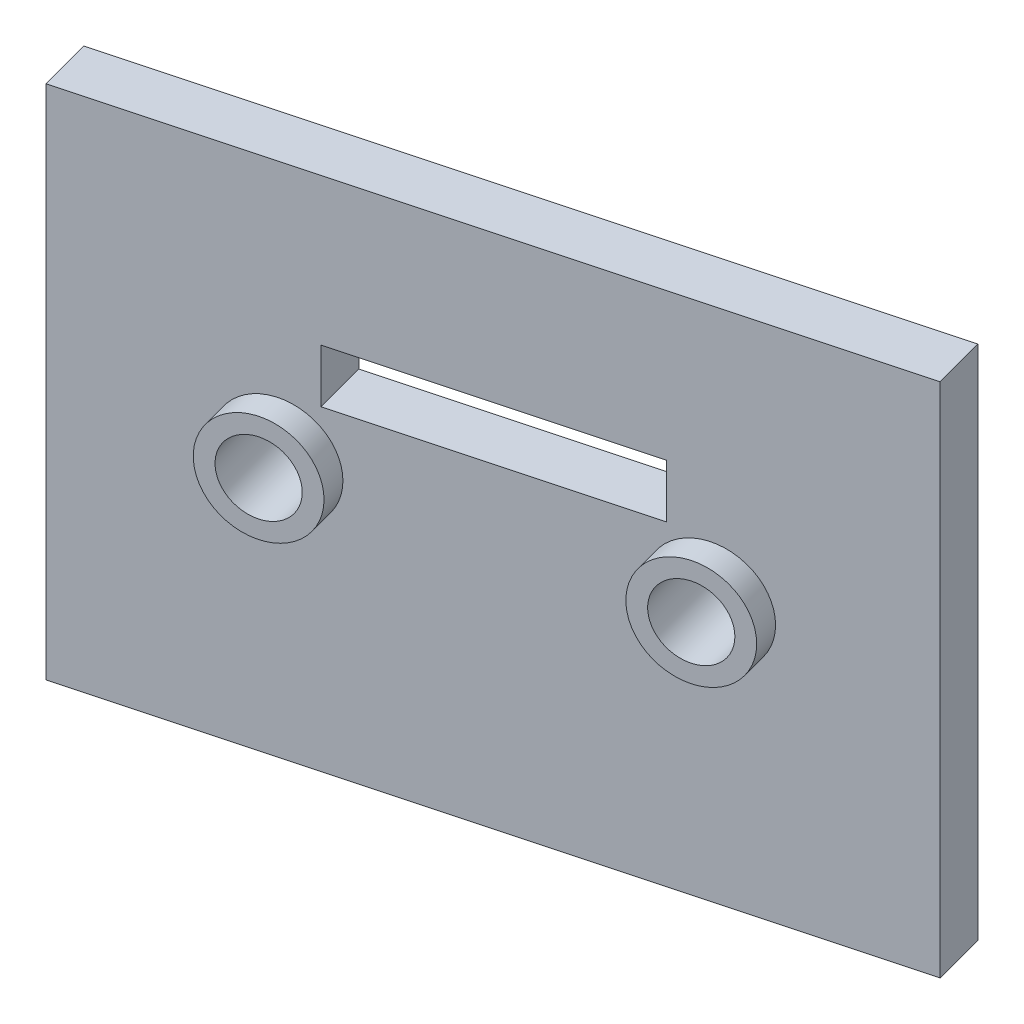
ISO-10303-21;
HEADER;
FILE_DESCRIPTION(('STEP AP214'),'2;1');
FILE_NAME('part.step','',(''),(''),'','','');
FILE_SCHEMA(('AUTOMOTIVE_DESIGN { 1 0 10303 214 1 1 1 1 }'));
ENDSEC;
DATA;
#1=APPLICATION_CONTEXT('core data for automotive mechanical design processes');
#2=APPLICATION_PROTOCOL_DEFINITION('international standard','automotive_design',2000,#1);
#3=PRODUCT_CONTEXT('',#1,'mechanical');
#4=PRODUCT('Part','Part','',(#3));
#5=PRODUCT_RELATED_PRODUCT_CATEGORY('part','',(#4));
#6=PRODUCT_DEFINITION_FORMATION('','',#4);
#7=PRODUCT_DEFINITION_CONTEXT('part definition',#1,'design');
#8=PRODUCT_DEFINITION('design','',#6,#7);
#9=PRODUCT_DEFINITION_SHAPE('','',#8);
#10=(LENGTH_UNIT() NAMED_UNIT(*) SI_UNIT(.MILLI.,.METRE.));
#11=(NAMED_UNIT(*) PLANE_ANGLE_UNIT() SI_UNIT($,.RADIAN.));
#12=(NAMED_UNIT(*) SI_UNIT($,.STERADIAN.) SOLID_ANGLE_UNIT());
#13=UNCERTAINTY_MEASURE_WITH_UNIT(LENGTH_MEASURE(1.E-05),#10,'distance_accuracy_value','');
#14=(GEOMETRIC_REPRESENTATION_CONTEXT(3) GLOBAL_UNCERTAINTY_ASSIGNED_CONTEXT((#13)) GLOBAL_UNIT_ASSIGNED_CONTEXT((#10,
#11,#12)) REPRESENTATION_CONTEXT('',''));
#15=CARTESIAN_POINT('',(0.,0.,0.));
#16=DIRECTION('',(0.,0.,1.));
#17=DIRECTION('',(1.,0.,0.));
#18=AXIS2_PLACEMENT_3D('',#15,#16,#17);
#19=CARTESIAN_POINT('',(28.4898075653215,0.5,2.9744443697168));
#20=DIRECTION('',(0.258819045102521,0.,0.965925826289069));
#21=DIRECTION('',(0.965925826289069,0.,-0.258819045102521));
#22=AXIS2_PLACEMENT_3D('',#19,#20,#21);
#23=PLANE('',#22);
#24=CARTESIAN_POINT('',(38.1036080524068,0.500000000000006,0.398434293008355));
#25=DIRECTION('',(0.258819045102521,0.,0.965925826289069));
#26=DIRECTION('',(0.965925826289069,0.,-0.258819045102521));
#27=AXIS2_PLACEMENT_3D('',#24,#25,#26);
#28=CIRCLE('',#27,3.);
#29=CARTESIAN_POINT('',(41.001385531274,0.500000000000006,-0.378022842299207));
#30=VERTEX_POINT('',#29);
#31=EDGE_CURVE('E146',#30,#30,#28,.T.);
#32=ORIENTED_EDGE('',*,*,#31,.F.);
#33=EDGE_LOOP('',(#32));
#34=FACE_BOUND('',#33,.T.);
#35=CARTESIAN_POINT('',(18.9394628566391,0.500000000000006,5.5334515218471));
#36=DIRECTION('',(0.258819045102521,0.,0.965925826289069));
#37=DIRECTION('',(0.965925826289069,0.,-0.258819045102521));
#38=AXIS2_PLACEMENT_3D('',#35,#36,#37);
#39=CIRCLE('',#38,3.);
#40=CARTESIAN_POINT('',(21.8372403355063,0.500000000000006,4.75699438653954));
#41=VERTEX_POINT('',#40);
#42=EDGE_CURVE('E150',#41,#41,#39,.T.);
#43=ORIENTED_EDGE('',*,*,#42,.F.);
#44=EDGE_LOOP('',(#43));
#45=FACE_BOUND('',#44,.T.);
#46=DIRECTION('',(0.,1.,0.));
#47=VECTOR('',#46,1.);
#48=CARTESIAN_POINT('',(48.2912870042474,15.,-2.33134605488487));
#49=LINE('',#48,#47);
#50=CARTESIAN_POINT('',(48.2912870042474,-14.,-2.33134605488487));
#51=VERTEX_POINT('',#50);
#52=CARTESIAN_POINT('',(48.2912870042474,15.,-2.33134605488487));
#53=VERTEX_POINT('',#52);
#54=EDGE_CURVE('E159',#51,#53,#49,.T.);
#55=ORIENTED_EDGE('',*,*,#54,.T.);
#56=DIRECTION('',(-0.965925826289069,0.,0.258819045102521));
#57=VECTOR('',#56,1.);
#58=CARTESIAN_POINT('',(8.68832812639561,15.,8.28023479431848));
#59=LINE('',#58,#57);
#60=CARTESIAN_POINT('',(8.68832812639561,15.,8.28023479431848));
#61=VERTEX_POINT('',#60);
#62=EDGE_CURVE('E162',#53,#61,#59,.T.);
#63=ORIENTED_EDGE('',*,*,#62,.T.);
#64=DIRECTION('',(0.,-1.,0.));
#65=VECTOR('',#64,1.);
#66=CARTESIAN_POINT('',(8.68832812639561,15.,8.28023479431848));
#67=LINE('',#66,#65);
#68=CARTESIAN_POINT('',(8.68832812639561,-14.,8.28023479431847));
#69=VERTEX_POINT('',#68);
#70=EDGE_CURVE('E165',#61,#69,#67,.T.);
#71=ORIENTED_EDGE('',*,*,#70,.T.);
#72=DIRECTION('',(0.965925826289069,0.,-0.258819045102521));
#73=VECTOR('',#72,1.);
#74=CARTESIAN_POINT('',(8.68832812639561,-14.,8.28023479431847));
#75=LINE('',#74,#73);
#76=EDGE_CURVE('E167',#69,#51,#75,.T.);
#77=ORIENTED_EDGE('',*,*,#76,.T.);
#78=EDGE_LOOP('',(#55,#63,#71,#77));
#79=FACE_BOUND('',#78,.T.);
#80=DIRECTION('',(0.,1.,0.));
#81=VECTOR('',#80,1.);
#82=CARTESIAN_POINT('',(20.8713145092172,0.5,5.01581343164206));
#83=LINE('',#82,#81);
#84=CARTESIAN_POINT('',(20.8713145092172,3.75000000000001,5.01581343164206));
#85=VERTEX_POINT('',#84);
#86=CARTESIAN_POINT('',(20.8713145092172,6.75000000000001,5.01581343164206));
#87=VERTEX_POINT('',#86);
#88=EDGE_CURVE('E106',#85,#87,#83,.T.);
#89=ORIENTED_EDGE('',*,*,#88,.T.);
#90=DIRECTION('',(0.965925826289068,0.,-0.258819045102521));
#91=VECTOR('',#90,1.);
#92=CARTESIAN_POINT('',(28.4898075653215,6.75000000000001,2.9744443697168));
#93=LINE('',#92,#91);
#94=CARTESIAN_POINT('',(36.1717563998287,6.75000000000001,0.916072383213399));
#95=VERTEX_POINT('',#94);
#96=EDGE_CURVE('E131',#87,#95,#93,.T.);
#97=ORIENTED_EDGE('',*,*,#96,.T.);
#98=DIRECTION('',(0.,-1.,0.));
#99=VECTOR('',#98,1.);
#100=CARTESIAN_POINT('',(36.1717563998287,0.5,0.916072383213399));
#101=LINE('',#100,#99);
#102=CARTESIAN_POINT('',(36.1717563998287,3.75000000000001,0.916072383213403));
#103=VERTEX_POINT('',#102);
#104=EDGE_CURVE('E126',#95,#103,#101,.T.);
#105=ORIENTED_EDGE('',*,*,#104,.T.);
#106=DIRECTION('',(0.965925826289068,0.,-0.258819045102521));
#107=VECTOR('',#106,1.);
#108=CARTESIAN_POINT('',(28.4898075653215,3.75000000000001,2.9744443697168));
#109=LINE('',#108,#107);
#110=EDGE_CURVE('E129',#85,#103,#109,.T.);
#111=ORIENTED_EDGE('',*,*,#110,.F.);
#112=EDGE_LOOP('',(#89,#97,#105,#111));
#113=FACE_BOUND('',#112,.T.);
#114=ADVANCED_FACE('F39',(#34,#45,#79,#113),#23,.T.);
#115=CARTESIAN_POINT('',(27.713350430014,0.5,0.076666890849595));
#116=DIRECTION('',(0.258819045102521,0.,0.965925826289069));
#117=DIRECTION('',(0.965925826289069,0.,-0.258819045102521));
#118=AXIS2_PLACEMENT_3D('',#115,#116,#117);
#119=PLANE('',#118);
#120=CARTESIAN_POINT('',(37.3271509170993,0.500000000000006,-2.49934318585885));
#121=DIRECTION('',(0.258819045102521,0.,0.965925826289069));
#122=DIRECTION('',(0.965925826289069,0.,-0.258819045102521));
#123=AXIS2_PLACEMENT_3D('',#120,#121,#122);
#124=CIRCLE('',#123,2.);
#125=CARTESIAN_POINT('',(39.2590025696774,0.500000000000006,-3.01698127606389));
#126=VERTEX_POINT('',#125);
#127=EDGE_CURVE('E143',#126,#126,#124,.T.);
#128=ORIENTED_EDGE('',*,*,#127,.T.);
#129=EDGE_LOOP('',(#128));
#130=FACE_BOUND('',#129,.T.);
#131=CARTESIAN_POINT('',(18.1630057213315,0.500000000000006,2.6356740429799));
#132=DIRECTION('',(0.258819045102521,0.,0.965925826289069));
#133=DIRECTION('',(0.965925826289069,0.,-0.258819045102521));
#134=AXIS2_PLACEMENT_3D('',#131,#132,#133);
#135=CIRCLE('',#134,2.);
#136=CARTESIAN_POINT('',(20.0948573739097,0.500000000000006,2.11803595277486));
#137=VERTEX_POINT('',#136);
#138=EDGE_CURVE('E137',#137,#137,#135,.T.);
#139=ORIENTED_EDGE('',*,*,#138,.T.);
#140=EDGE_LOOP('',(#139));
#141=FACE_BOUND('',#140,.T.);
#142=DIRECTION('',(0.965925826289068,0.,-0.258819045102521));
#143=VECTOR('',#142,1.);
#144=CARTESIAN_POINT('',(1.87560918953314,3.75,6.99986879048075));
#145=LINE('',#144,#143);
#146=CARTESIAN_POINT('',(20.0948573739097,3.75,2.11803595277486));
#147=VERTEX_POINT('',#146);
#148=CARTESIAN_POINT('',(35.3952992645211,3.75000000000001,-1.9817050956538));
#149=VERTEX_POINT('',#148);
#150=EDGE_CURVE('E111',#147,#149,#145,.T.);
#151=ORIENTED_EDGE('',*,*,#150,.T.);
#152=DIRECTION('',(0.,-1.,0.));
#153=VECTOR('',#152,1.);
#154=CARTESIAN_POINT('',(35.3952992645211,0.5,-1.98170509565381));
#155=LINE('',#154,#153);
#156=CARTESIAN_POINT('',(35.3952992645211,6.75000000000001,-1.98170509565381));
#157=VERTEX_POINT('',#156);
#158=EDGE_CURVE('E121',#157,#149,#155,.T.);
#159=ORIENTED_EDGE('',*,*,#158,.F.);
#160=DIRECTION('',(0.965925826289068,0.,-0.258819045102521));
#161=VECTOR('',#160,1.);
#162=CARTESIAN_POINT('',(27.713350430014,6.75000000000001,0.076666890849595));
#163=LINE('',#162,#161);
#164=CARTESIAN_POINT('',(20.0948573739097,6.75000000000001,2.11803595277486));
#165=VERTEX_POINT('',#164);
#166=EDGE_CURVE('E11',#165,#157,#163,.T.);
#167=ORIENTED_EDGE('',*,*,#166,.F.);
#168=DIRECTION('',(0.,1.,0.));
#169=VECTOR('',#168,1.);
#170=CARTESIAN_POINT('',(20.0948573739097,0.5,2.11803595277486));
#171=LINE('',#170,#169);
#172=EDGE_CURVE('E103',#147,#165,#171,.T.);
#173=ORIENTED_EDGE('',*,*,#172,.F.);
#174=EDGE_LOOP('',(#151,#159,#167,#173));
#175=FACE_BOUND('',#174,.T.);
#176=DIRECTION('',(0.,1.,0.));
#177=VECTOR('',#176,1.);
#178=CARTESIAN_POINT('',(47.5148298689398,15.,-5.22912353375208));
#179=LINE('',#178,#177);
#180=CARTESIAN_POINT('',(47.5148298689398,-14.,-5.22912353375208));
#181=VERTEX_POINT('',#180);
#182=CARTESIAN_POINT('',(47.5148298689398,15.,-5.22912353375208));
#183=VERTEX_POINT('',#182);
#184=EDGE_CURVE('E156',#181,#183,#179,.T.);
#185=ORIENTED_EDGE('',*,*,#184,.F.);
#186=DIRECTION('',(0.965925826289069,0.,-0.258819045102521));
#187=VECTOR('',#186,1.);
#188=CARTESIAN_POINT('',(7.91187099108805,-14.,5.38245731545127));
#189=LINE('',#188,#187);
#190=CARTESIAN_POINT('',(7.91187099108805,-14.,5.38245731545127));
#191=VERTEX_POINT('',#190);
#192=EDGE_CURVE('E163',#191,#181,#189,.T.);
#193=ORIENTED_EDGE('',*,*,#192,.F.);
#194=DIRECTION('',(0.,-1.,0.));
#195=VECTOR('',#194,1.);
#196=CARTESIAN_POINT('',(7.91187099108804,15.,5.38245731545127));
#197=LINE('',#196,#195);
#198=CARTESIAN_POINT('',(7.91187099108804,15.,5.38245731545127));
#199=VERTEX_POINT('',#198);
#200=EDGE_CURVE('E174',#199,#191,#197,.T.);
#201=ORIENTED_EDGE('',*,*,#200,.F.);
#202=DIRECTION('',(-0.965925826289069,0.,0.258819045102521));
#203=VECTOR('',#202,1.);
#204=CARTESIAN_POINT('',(7.91187099108804,15.,5.38245731545127));
#205=LINE('',#204,#203);
#206=EDGE_CURVE('E172',#183,#199,#205,.T.);
#207=ORIENTED_EDGE('',*,*,#206,.F.);
#208=EDGE_LOOP('',(#185,#193,#201,#207));
#209=FACE_BOUND('',#208,.T.);
#210=ADVANCED_FACE('F118',(#130,#141,#175,#209),#119,.F.);
#211=CARTESIAN_POINT('',(48.2912870042474,15.,-2.33134605488487));
#212=DIRECTION('',(-0.965925826289069,0.,0.258819045102521));
#213=DIRECTION('',(0.258819045102521,0.,0.965925826289069));
#214=AXIS2_PLACEMENT_3D('',#211,#212,#213);
#215=PLANE('',#214);
#216=ORIENTED_EDGE('',*,*,#184,.T.);
#217=DIRECTION('',(-0.258819045102521,0.,-0.965925826289069));
#218=VECTOR('',#217,1.);
#219=CARTESIAN_POINT('',(48.2912870042474,15.,-2.33134605488487));
#220=LINE('',#219,#218);
#221=EDGE_CURVE('E47',#53,#183,#220,.T.);
#222=ORIENTED_EDGE('',*,*,#221,.F.);
#223=ORIENTED_EDGE('',*,*,#54,.F.);
#224=DIRECTION('',(-0.258819045102521,0.,-0.965925826289069));
#225=VECTOR('',#224,1.);
#226=CARTESIAN_POINT('',(48.2912870042474,-14.,-2.33134605488487));
#227=LINE('',#226,#225);
#228=EDGE_CURVE('E169',#51,#181,#227,.T.);
#229=ORIENTED_EDGE('',*,*,#228,.T.);
#230=EDGE_LOOP('',(#216,#222,#223,#229));
#231=FACE_BOUND('',#230,.T.);
#232=ADVANCED_FACE('F41',(#231),#215,.F.);
#233=CARTESIAN_POINT('',(8.68832812639561,15.,8.28023479431848));
#234=DIRECTION('',(0.,-1.,0.));
#235=DIRECTION('',(-0.258819045102521,0.,-0.965925826289069));
#236=AXIS2_PLACEMENT_3D('',#233,#234,#235);
#237=PLANE('',#236);
#238=ORIENTED_EDGE('',*,*,#206,.T.);
#239=DIRECTION('',(-0.258819045102521,0.,-0.965925826289069));
#240=VECTOR('',#239,1.);
#241=CARTESIAN_POINT('',(8.68832812639561,15.,8.28023479431848));
#242=LINE('',#241,#240);
#243=EDGE_CURVE('E182',#61,#199,#242,.T.);
#244=ORIENTED_EDGE('',*,*,#243,.F.);
#245=ORIENTED_EDGE('',*,*,#62,.F.);
#246=ORIENTED_EDGE('',*,*,#221,.T.);
#247=EDGE_LOOP('',(#238,#244,#245,#246));
#248=FACE_BOUND('',#247,.T.);
#249=ADVANCED_FACE('F187',(#248),#237,.F.);
#250=CARTESIAN_POINT('',(8.68832812639561,15.,8.28023479431848));
#251=DIRECTION('',(0.965925826289069,0.,-0.258819045102521));
#252=DIRECTION('',(0.,1.,0.));
#253=AXIS2_PLACEMENT_3D('',#250,#251,#252);
#254=PLANE('',#253);
#255=ORIENTED_EDGE('',*,*,#200,.T.);
#256=DIRECTION('',(-0.258819045102521,0.,-0.965925826289069));
#257=VECTOR('',#256,1.);
#258=CARTESIAN_POINT('',(8.68832812639561,-14.,8.28023479431847));
#259=LINE('',#258,#257);
#260=EDGE_CURVE('E179',#69,#191,#259,.T.);
#261=ORIENTED_EDGE('',*,*,#260,.F.);
#262=ORIENTED_EDGE('',*,*,#70,.F.);
#263=ORIENTED_EDGE('',*,*,#243,.T.);
#264=EDGE_LOOP('',(#255,#261,#262,#263));
#265=FACE_BOUND('',#264,.T.);
#266=ADVANCED_FACE('F197',(#265),#254,.F.);
#267=CARTESIAN_POINT('',(8.68832812639561,-14.,8.28023479431847));
#268=DIRECTION('',(0.,1.,0.));
#269=DIRECTION('',(0.258819045102521,0.,0.965925826289069));
#270=AXIS2_PLACEMENT_3D('',#267,#268,#269);
#271=PLANE('',#270);
#272=ORIENTED_EDGE('',*,*,#192,.T.);
#273=ORIENTED_EDGE('',*,*,#228,.F.);
#274=ORIENTED_EDGE('',*,*,#76,.F.);
#275=ORIENTED_EDGE('',*,*,#260,.T.);
#276=EDGE_LOOP('',(#272,#273,#274,#275));
#277=FACE_BOUND('',#276,.T.);
#278=ADVANCED_FACE('F201',(#277),#271,.F.);
#279=CARTESIAN_POINT('',(19.3276914242929,0.500000000000006,6.98234026128071));
#280=DIRECTION('',(-0.258819045102521,0.,-0.965925826289069));
#281=DIRECTION('',(-0.965925826289069,0.,0.258819045102521));
#282=AXIS2_PLACEMENT_3D('',#279,#280,#281);
#283=CYLINDRICAL_SURFACE('',#282,3.);
#284=CARTESIAN_POINT('',(19.3276914242929,0.500000000000006,6.98234026128071));
#285=DIRECTION('',(0.258819045102521,0.,0.965925826289069));
#286=DIRECTION('',(0.965925826289069,0.,-0.258819045102521));
#287=AXIS2_PLACEMENT_3D('',#284,#285,#286);
#288=CIRCLE('',#287,3.);
#289=CARTESIAN_POINT('',(22.2254689031601,0.500000000000006,6.20588312597314));
#290=VERTEX_POINT('',#289);
#291=EDGE_CURVE('E153',#290,#290,#288,.T.);
#292=ORIENTED_EDGE('',*,*,#291,.F.);
#293=EDGE_LOOP('',(#292));
#294=FACE_BOUND('',#293,.T.);
#295=ORIENTED_EDGE('',*,*,#42,.T.);
#296=EDGE_LOOP('',(#295));
#297=FACE_BOUND('',#296,.T.);
#298=ADVANCED_FACE('F245',(#294,#297),#283,.T.);
#299=CARTESIAN_POINT('',(19.3276914242929,0.500000000000006,6.98234026128071));
#300=DIRECTION('',(0.258819045102521,0.,0.965925826289069));
#301=DIRECTION('',(0.965925826289069,0.,-0.258819045102521));
#302=AXIS2_PLACEMENT_3D('',#299,#300,#301);
#303=PLANE('',#302);
#304=CARTESIAN_POINT('',(19.3276914242929,0.500000000000006,6.98234026128071));
#305=DIRECTION('',(0.258819045102521,0.,0.965925826289069));
#306=DIRECTION('',(0.965925826289069,0.,-0.258819045102521));
#307=AXIS2_PLACEMENT_3D('',#304,#305,#306);
#308=CIRCLE('',#307,2.);
#309=CARTESIAN_POINT('',(21.259543076871,0.500000000000006,6.46470217107566));
#310=VERTEX_POINT('',#309);
#311=EDGE_CURVE('E134',#310,#310,#308,.T.);
#312=ORIENTED_EDGE('',*,*,#311,.F.);
#313=EDGE_LOOP('',(#312));
#314=FACE_BOUND('',#313,.T.);
#315=ORIENTED_EDGE('',*,*,#291,.T.);
#316=EDGE_LOOP('',(#315));
#317=FACE_BOUND('',#316,.T.);
#318=ADVANCED_FACE('F241',(#314,#317),#303,.T.);
#319=CARTESIAN_POINT('',(38.4918366200606,0.500000000000006,1.84732303244196));
#320=DIRECTION('',(-0.258819045102521,0.,-0.965925826289069));
#321=DIRECTION('',(-0.965925826289069,0.,0.258819045102521));
#322=AXIS2_PLACEMENT_3D('',#319,#320,#321);
#323=CYLINDRICAL_SURFACE('',#322,3.);
#324=CARTESIAN_POINT('',(38.4918366200606,0.500000000000006,1.84732303244196));
#325=DIRECTION('',(0.258819045102521,0.,0.965925826289069));
#326=DIRECTION('',(0.965925826289069,0.,-0.258819045102521));
#327=AXIS2_PLACEMENT_3D('',#324,#325,#326);
#328=CIRCLE('',#327,3.);
#329=CARTESIAN_POINT('',(41.3896140989278,0.500000000000006,1.0708658971344));
#330=VERTEX_POINT('',#329);
#331=EDGE_CURVE('E147',#330,#330,#328,.T.);
#332=ORIENTED_EDGE('',*,*,#331,.F.);
#333=EDGE_LOOP('',(#332));
#334=FACE_BOUND('',#333,.T.);
#335=ORIENTED_EDGE('',*,*,#31,.T.);
#336=EDGE_LOOP('',(#335));
#337=FACE_BOUND('',#336,.T.);
#338=ADVANCED_FACE('F237',(#334,#337),#323,.T.);
#339=CARTESIAN_POINT('',(38.4918366200606,0.500000000000006,1.84732303244196));
#340=DIRECTION('',(0.258819045102521,0.,0.965925826289069));
#341=DIRECTION('',(0.965925826289069,0.,-0.258819045102521));
#342=AXIS2_PLACEMENT_3D('',#339,#340,#341);
#343=PLANE('',#342);
#344=CARTESIAN_POINT('',(38.4918366200606,0.500000000000006,1.84732303244196));
#345=DIRECTION('',(0.258819045102521,0.,0.965925826289069));
#346=DIRECTION('',(0.965925826289069,0.,-0.258819045102521));
#347=AXIS2_PLACEMENT_3D('',#344,#345,#346);
#348=CIRCLE('',#347,2.);
#349=CARTESIAN_POINT('',(40.4236882726387,0.500000000000006,1.32968494223692));
#350=VERTEX_POINT('',#349);
#351=EDGE_CURVE('E140',#350,#350,#348,.T.);
#352=ORIENTED_EDGE('',*,*,#351,.F.);
#353=EDGE_LOOP('',(#352));
#354=FACE_BOUND('',#353,.T.);
#355=ORIENTED_EDGE('',*,*,#331,.T.);
#356=EDGE_LOOP('',(#355));
#357=FACE_BOUND('',#356,.T.);
#358=ADVANCED_FACE('F233',(#354,#357),#343,.T.);
#359=CARTESIAN_POINT('',(38.4918366200606,0.500000000000006,1.84732303244196));
#360=DIRECTION('',(0.258819045102521,0.,0.965925826289069));
#361=DIRECTION('',(0.965925826289069,0.,-0.258819045102521));
#362=AXIS2_PLACEMENT_3D('',#359,#360,#361);
#363=CYLINDRICAL_SURFACE('',#362,2.);
#364=ORIENTED_EDGE('',*,*,#127,.F.);
#365=EDGE_LOOP('',(#364));
#366=FACE_BOUND('',#365,.T.);
#367=ORIENTED_EDGE('',*,*,#351,.T.);
#368=EDGE_LOOP('',(#367));
#369=FACE_BOUND('',#368,.T.);
#370=ADVANCED_FACE('F224',(#366,#369),#363,.F.);
#371=CARTESIAN_POINT('',(19.3276914242929,0.500000000000006,6.98234026128071));
#372=DIRECTION('',(0.258819045102521,0.,0.965925826289069));
#373=DIRECTION('',(0.965925826289069,0.,-0.258819045102521));
#374=AXIS2_PLACEMENT_3D('',#371,#372,#373);
#375=CYLINDRICAL_SURFACE('',#374,2.);
#376=ORIENTED_EDGE('',*,*,#138,.F.);
#377=EDGE_LOOP('',(#376));
#378=FACE_BOUND('',#377,.T.);
#379=ORIENTED_EDGE('',*,*,#311,.T.);
#380=EDGE_LOOP('',(#379));
#381=FACE_BOUND('',#380,.T.);
#382=ADVANCED_FACE('F216',(#378,#381),#375,.F.);
#383=CARTESIAN_POINT('',(35.1364802194186,6.75000000000001,-2.94763092194287));
#384=DIRECTION('',(0.,-1.,0.));
#385=DIRECTION('',(0.,0.,-1.));
#386=AXIS2_PLACEMENT_3D('',#383,#384,#385);
#387=PLANE('',#386);
#388=DIRECTION('',(0.258819045102521,0.,0.965925826289068));
#389=VECTOR('',#388,1.);
#390=CARTESIAN_POINT('',(19.8360383288071,6.75000000000001,1.15211012648579));
#391=LINE('',#390,#389);
#392=EDGE_CURVE('E115',#165,#87,#391,.T.);
#393=ORIENTED_EDGE('',*,*,#392,.F.);
#394=ORIENTED_EDGE('',*,*,#166,.T.);
#395=DIRECTION('',(0.258819045102521,0.,0.965925826289068));
#396=VECTOR('',#395,1.);
#397=CARTESIAN_POINT('',(35.1364802194186,6.75000000000001,-2.94763092194287));
#398=LINE('',#397,#396);
#399=EDGE_CURVE('E108',#157,#95,#398,.T.);
#400=ORIENTED_EDGE('',*,*,#399,.T.);
#401=ORIENTED_EDGE('',*,*,#96,.F.);
#402=EDGE_LOOP('',(#393,#394,#400,#401));
#403=FACE_BOUND('',#402,.T.);
#404=ADVANCED_FACE('F214',(#403),#387,.T.);
#405=CARTESIAN_POINT('',(35.1364802194186,-5.74999999999999,-2.94763092194287));
#406=DIRECTION('',(-0.965925826289068,0.,0.258819045102521));
#407=DIRECTION('',(0.258819045102521,0.,0.965925826289068));
#408=AXIS2_PLACEMENT_3D('',#405,#406,#407);
#409=PLANE('',#408);
#410=ORIENTED_EDGE('',*,*,#399,.F.);
#411=ORIENTED_EDGE('',*,*,#158,.T.);
#412=DIRECTION('',(-0.258819045102521,0.,-0.965925826289068));
#413=VECTOR('',#412,1.);
#414=CARTESIAN_POINT('',(40.312861121469,3.75000000000001,16.3708856038385));
#415=LINE('',#414,#413);
#416=EDGE_CURVE('E59',#103,#149,#415,.T.);
#417=ORIENTED_EDGE('',*,*,#416,.F.);
#418=ORIENTED_EDGE('',*,*,#104,.F.);
#419=EDGE_LOOP('',(#410,#411,#417,#418));
#420=FACE_BOUND('',#419,.T.);
#421=ADVANCED_FACE('F209',(#420),#409,.T.);
#422=CARTESIAN_POINT('',(19.8360383288071,-5.74999999999999,1.15211012648579));
#423=DIRECTION('',(0.965925826289068,0.,-0.258819045102521));
#424=DIRECTION('',(-0.258819045102521,0.,-0.965925826289068));
#425=AXIS2_PLACEMENT_3D('',#422,#423,#424);
#426=PLANE('',#425);
#427=DIRECTION('',(-0.258819045102521,0.,-0.965925826289068));
#428=VECTOR('',#427,1.);
#429=CARTESIAN_POINT('',(25.0124192308576,3.75000000000001,20.4706266522672));
#430=LINE('',#429,#428);
#431=EDGE_CURVE('E54',#85,#147,#430,.T.);
#432=ORIENTED_EDGE('',*,*,#431,.T.);
#433=ORIENTED_EDGE('',*,*,#172,.T.);
#434=ORIENTED_EDGE('',*,*,#392,.T.);
#435=ORIENTED_EDGE('',*,*,#88,.F.);
#436=EDGE_LOOP('',(#432,#433,#434,#435));
#437=FACE_BOUND('',#436,.T.);
#438=ADVANCED_FACE('F100',(#437),#426,.T.);
#439=CARTESIAN_POINT('',(40.312861121469,3.75000000000001,16.3708856038385));
#440=DIRECTION('',(0.,-1.,0.));
#441=DIRECTION('',(0.,0.,-1.));
#442=AXIS2_PLACEMENT_3D('',#439,#440,#441);
#443=PLANE('',#442);
#444=ORIENTED_EDGE('',*,*,#110,.T.);
#445=ORIENTED_EDGE('',*,*,#416,.T.);
#446=ORIENTED_EDGE('',*,*,#150,.F.);
#447=ORIENTED_EDGE('',*,*,#431,.F.);
#448=EDGE_LOOP('',(#444,#445,#446,#447));
#449=FACE_BOUND('',#448,.T.);
#450=ADVANCED_FACE('F112',(#449),#443,.F.);
#451=CLOSED_SHELL('',(#114,#210,#232,#249,#266,#278,#298,#318,#338,#358,#370,#382,#404,#421,
#438,#450));
#452=MANIFOLD_SOLID_BREP('B2',#451);
#453=ADVANCED_BREP_SHAPE_REPRESENTATION('',(#18,#452),#14);
#454=SHAPE_DEFINITION_REPRESENTATION(#9,#453);
ENDSEC;
END-ISO-10303-21;
